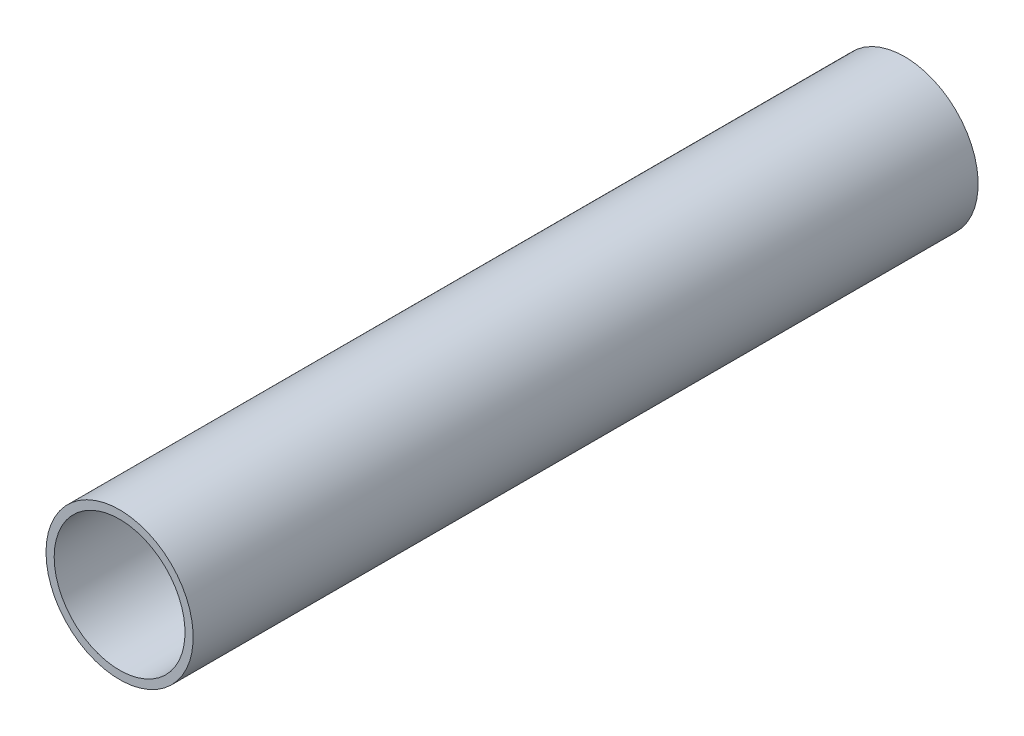
ISO-10303-21;
HEADER;
FILE_DESCRIPTION(('STEP AP214'),'2;1');
FILE_NAME('part.step','',(''),(''),'','','');
FILE_SCHEMA(('AUTOMOTIVE_DESIGN { 1 0 10303 214 1 1 1 1 }'));
ENDSEC;
DATA;
#1=APPLICATION_CONTEXT('core data for automotive mechanical design processes');
#2=APPLICATION_PROTOCOL_DEFINITION('international standard','automotive_design',2000,#1);
#3=PRODUCT_CONTEXT('',#1,'mechanical');
#4=PRODUCT('Part','Part','',(#3));
#5=PRODUCT_RELATED_PRODUCT_CATEGORY('part','',(#4));
#6=PRODUCT_DEFINITION_FORMATION('','',#4);
#7=PRODUCT_DEFINITION_CONTEXT('part definition',#1,'design');
#8=PRODUCT_DEFINITION('design','',#6,#7);
#9=PRODUCT_DEFINITION_SHAPE('','',#8);
#10=(LENGTH_UNIT() NAMED_UNIT(*) SI_UNIT(.MILLI.,.METRE.));
#11=(NAMED_UNIT(*) PLANE_ANGLE_UNIT() SI_UNIT($,.RADIAN.));
#12=(NAMED_UNIT(*) SI_UNIT($,.STERADIAN.) SOLID_ANGLE_UNIT());
#13=UNCERTAINTY_MEASURE_WITH_UNIT(LENGTH_MEASURE(1.E-05),#10,'distance_accuracy_value','');
#14=(GEOMETRIC_REPRESENTATION_CONTEXT(3) GLOBAL_UNCERTAINTY_ASSIGNED_CONTEXT((#13)) GLOBAL_UNIT_ASSIGNED_CONTEXT((#10,
#11,#12)) REPRESENTATION_CONTEXT('',''));
#15=CARTESIAN_POINT('',(0.,0.,0.));
#16=DIRECTION('',(0.,0.,1.));
#17=DIRECTION('',(1.,0.,0.));
#18=AXIS2_PLACEMENT_3D('',#15,#16,#17);
#19=CARTESIAN_POINT('',(0.,0.,304.8));
#20=DIRECTION('',(0.,0.,1.));
#21=DIRECTION('',(1.,0.,0.));
#22=AXIS2_PLACEMENT_3D('',#19,#20,#21);
#23=PLANE('',#22);
#24=CARTESIAN_POINT('',(0.,0.,304.8));
#25=DIRECTION('',(0.,0.,1.));
#26=DIRECTION('',(1.,0.,0.));
#27=AXIS2_PLACEMENT_3D('',#24,#25,#26);
#28=CIRCLE('',#27,57.15);
#29=CARTESIAN_POINT('',(-57.15,0.,304.8));
#30=VERTEX_POINT('',#29);
#31=EDGE_CURVE('E10',#30,#30,#28,.T.);
#32=ORIENTED_EDGE('',*,*,#31,.T.);
#33=EDGE_LOOP('',(#32));
#34=FACE_BOUND('',#33,.T.);
#35=CARTESIAN_POINT('',(0.,0.,304.8));
#36=DIRECTION('',(0.,0.,1.));
#37=DIRECTION('',(1.,0.,0.));
#38=AXIS2_PLACEMENT_3D('',#35,#36,#37);
#39=CIRCLE('',#38,50.8);
#40=CARTESIAN_POINT('',(-50.8,0.,304.8));
#41=VERTEX_POINT('',#40);
#42=EDGE_CURVE('E41',#41,#41,#39,.T.);
#43=ORIENTED_EDGE('',*,*,#42,.F.);
#44=EDGE_LOOP('',(#43));
#45=FACE_BOUND('',#44,.T.);
#46=ADVANCED_FACE('F30',(#34,#45),#23,.T.);
#47=CARTESIAN_POINT('',(0.,0.,-304.8));
#48=DIRECTION('',(0.,0.,1.));
#49=DIRECTION('',(1.,0.,0.));
#50=AXIS2_PLACEMENT_3D('',#47,#48,#49);
#51=PLANE('',#50);
#52=CARTESIAN_POINT('',(0.,0.,-304.8));
#53=DIRECTION('',(0.,0.,1.));
#54=DIRECTION('',(1.,0.,0.));
#55=AXIS2_PLACEMENT_3D('',#52,#53,#54);
#56=CIRCLE('',#55,57.15);
#57=CARTESIAN_POINT('',(-57.15,0.,-304.8));
#58=VERTEX_POINT('',#57);
#59=EDGE_CURVE('E34',#58,#58,#56,.T.);
#60=ORIENTED_EDGE('',*,*,#59,.F.);
#61=EDGE_LOOP('',(#60));
#62=FACE_BOUND('',#61,.T.);
#63=CARTESIAN_POINT('',(0.,0.,-304.8));
#64=DIRECTION('',(0.,0.,1.));
#65=DIRECTION('',(1.,0.,0.));
#66=AXIS2_PLACEMENT_3D('',#63,#64,#65);
#67=CIRCLE('',#66,50.8);
#68=CARTESIAN_POINT('',(-50.8,0.,-304.8));
#69=VERTEX_POINT('',#68);
#70=EDGE_CURVE('E43',#69,#69,#67,.T.);
#71=ORIENTED_EDGE('',*,*,#70,.T.);
#72=EDGE_LOOP('',(#71));
#73=FACE_BOUND('',#72,.T.);
#74=ADVANCED_FACE('F53',(#62,#73),#51,.F.);
#75=CARTESIAN_POINT('',(0.,0.,304.8));
#76=DIRECTION('',(0.,0.,-1.));
#77=DIRECTION('',(-1.,0.,0.));
#78=AXIS2_PLACEMENT_3D('',#75,#76,#77);
#79=CYLINDRICAL_SURFACE('',#78,57.15);
#80=CARTESIAN_POINT('',(-57.15,0.,304.8));
#81=CARTESIAN_POINT('',(-57.15,0.,298.45));
#82=CARTESIAN_POINT('',(-57.15,0.,292.1));
#83=CARTESIAN_POINT('',(-57.15,0.,279.4));
#84=CARTESIAN_POINT('',(-57.15,0.,273.05));
#85=CARTESIAN_POINT('',(-57.15,0.,260.35));
#86=CARTESIAN_POINT('',(-57.15,0.,254.));
#87=CARTESIAN_POINT('',(-57.15,0.,241.3));
#88=CARTESIAN_POINT('',(-57.15,0.,234.95));
#89=CARTESIAN_POINT('',(-57.15,0.,222.25));
#90=CARTESIAN_POINT('',(-57.15,0.,215.9));
#91=CARTESIAN_POINT('',(-57.15,0.,203.2));
#92=CARTESIAN_POINT('',(-57.15,0.,196.85));
#93=CARTESIAN_POINT('',(-57.15,0.,184.15));
#94=CARTESIAN_POINT('',(-57.15,0.,177.8));
#95=CARTESIAN_POINT('',(-57.15,0.,165.1));
#96=CARTESIAN_POINT('',(-57.15,0.,158.75));
#97=CARTESIAN_POINT('',(-57.15,0.,146.05));
#98=CARTESIAN_POINT('',(-57.15,0.,139.7));
#99=CARTESIAN_POINT('',(-57.15,0.,127.));
#100=CARTESIAN_POINT('',(-57.15,0.,120.65));
#101=CARTESIAN_POINT('',(-57.15,0.,107.95));
#102=CARTESIAN_POINT('',(-57.15,0.,101.6));
#103=CARTESIAN_POINT('',(-57.15,0.,88.9));
#104=CARTESIAN_POINT('',(-57.15,0.,82.55));
#105=CARTESIAN_POINT('',(-57.15,0.,69.85));
#106=CARTESIAN_POINT('',(-57.15,0.,63.5));
#107=CARTESIAN_POINT('',(-57.15,0.,50.8));
#108=CARTESIAN_POINT('',(-57.15,0.,44.45));
#109=CARTESIAN_POINT('',(-57.15,0.,31.75));
#110=CARTESIAN_POINT('',(-57.15,0.,25.4));
#111=CARTESIAN_POINT('',(-57.15,0.,12.7));
#112=CARTESIAN_POINT('',(-57.15,0.,6.34999999999995));
#113=CARTESIAN_POINT('',(-57.15,0.,-6.35000000000006));
#114=CARTESIAN_POINT('',(-57.15,0.,-12.7000000000001));
#115=CARTESIAN_POINT('',(-57.15,0.,-25.4000000000001));
#116=CARTESIAN_POINT('',(-57.15,0.,-31.7500000000001));
#117=CARTESIAN_POINT('',(-57.15,0.,-44.4500000000001));
#118=CARTESIAN_POINT('',(-57.15,0.,-50.8000000000001));
#119=CARTESIAN_POINT('',(-57.15,0.,-63.5000000000001));
#120=CARTESIAN_POINT('',(-57.15,0.,-69.8500000000001));
#121=CARTESIAN_POINT('',(-57.15,0.,-82.5500000000001));
#122=CARTESIAN_POINT('',(-57.15,0.,-88.9000000000001));
#123=CARTESIAN_POINT('',(-57.15,0.,-101.6));
#124=CARTESIAN_POINT('',(-57.15,0.,-107.95));
#125=CARTESIAN_POINT('',(-57.15,0.,-120.65));
#126=CARTESIAN_POINT('',(-57.15,0.,-127.));
#127=CARTESIAN_POINT('',(-57.15,0.,-139.7));
#128=CARTESIAN_POINT('',(-57.15,0.,-146.05));
#129=CARTESIAN_POINT('',(-57.15,0.,-158.75));
#130=CARTESIAN_POINT('',(-57.15,0.,-165.1));
#131=CARTESIAN_POINT('',(-57.15,0.,-177.8));
#132=CARTESIAN_POINT('',(-57.15,0.,-184.15));
#133=CARTESIAN_POINT('',(-57.15,0.,-196.85));
#134=CARTESIAN_POINT('',(-57.15,0.,-203.2));
#135=CARTESIAN_POINT('',(-57.15,0.,-215.9));
#136=CARTESIAN_POINT('',(-57.15,0.,-222.25));
#137=CARTESIAN_POINT('',(-57.15,0.,-234.95));
#138=CARTESIAN_POINT('',(-57.15,0.,-241.3));
#139=CARTESIAN_POINT('',(-57.15,0.,-254.));
#140=CARTESIAN_POINT('',(-57.15,0.,-260.35));
#141=CARTESIAN_POINT('',(-57.15,0.,-273.05));
#142=CARTESIAN_POINT('',(-57.15,0.,-279.4));
#143=CARTESIAN_POINT('',(-57.15,0.,-292.1));
#144=CARTESIAN_POINT('',(-57.15,0.,-298.45));
#145=CARTESIAN_POINT('',(-57.15,0.,-304.8));
#146=B_SPLINE_CURVE_WITH_KNOTS('',3,(#80,#81,#82,#83,#84,#85,#86,#87,#88,#89,#90,#91,#92,#93,
#94,#95,#96,#97,#98,#99,#100,#101,#102,#103,#104,#105,#106,#107,#108,#109,#110,#111,#112,#113,
#114,#115,#116,#117,#118,#119,#120,#121,#122,#123,#124,#125,#126,#127,#128,#129,#130,#131,#132,
#133,#134,#135,#136,#137,#138,#139,#140,#141,#142,#143,#144,#145),.UNSPECIFIED.,.F.,.F.,(4,2,2,
2,2,2,2,2,2,2,2,2,2,2,2,2,2,2,2,2,2,2,2,2,2,2,2,2,2,2,2,2,4),(0.,19.05,38.1,57.15,76.2,95.25,
114.3,133.35,152.4,171.45,190.5,209.55,228.6,247.65,266.7,285.75,304.8,323.85,342.9,361.95,381.,
400.05,419.1,438.15,457.2,476.25,495.3,514.35,533.4,552.45,571.5,590.55,609.6),.UNSPECIFIED.);
#147=EDGE_CURVE('BSEAM32',#30,#58,#146,.T.);
#148=ORIENTED_EDGE('',*,*,#31,.F.);
#149=ORIENTED_EDGE('',*,*,#59,.T.);
#150=ORIENTED_EDGE('',*,*,#147,.T.);
#151=ORIENTED_EDGE('',*,*,#147,.F.);
#152=EDGE_LOOP('',(#148,#150,#149,#151));
#153=FACE_BOUND('',#152,.T.);
#154=ADVANCED_FACE('F32',(#153),#79,.T.);
#155=CARTESIAN_POINT('',(0.,0.,304.8));
#156=DIRECTION('',(0.,0.,-1.));
#157=DIRECTION('',(-1.,0.,0.));
#158=AXIS2_PLACEMENT_3D('',#155,#156,#157);
#159=CYLINDRICAL_SURFACE('',#158,50.8);
#160=CARTESIAN_POINT('',(-50.8,0.,304.8));
#161=CARTESIAN_POINT('',(-50.8,0.,298.45));
#162=CARTESIAN_POINT('',(-50.8,0.,292.1));
#163=CARTESIAN_POINT('',(-50.8,0.,279.4));
#164=CARTESIAN_POINT('',(-50.8,0.,273.05));
#165=CARTESIAN_POINT('',(-50.8,0.,260.35));
#166=CARTESIAN_POINT('',(-50.8,0.,254.));
#167=CARTESIAN_POINT('',(-50.8,0.,241.3));
#168=CARTESIAN_POINT('',(-50.8,0.,234.95));
#169=CARTESIAN_POINT('',(-50.8,0.,222.25));
#170=CARTESIAN_POINT('',(-50.8,0.,215.9));
#171=CARTESIAN_POINT('',(-50.8,0.,203.2));
#172=CARTESIAN_POINT('',(-50.8,0.,196.85));
#173=CARTESIAN_POINT('',(-50.8,0.,184.15));
#174=CARTESIAN_POINT('',(-50.8,0.,177.8));
#175=CARTESIAN_POINT('',(-50.8,0.,165.1));
#176=CARTESIAN_POINT('',(-50.8,0.,158.75));
#177=CARTESIAN_POINT('',(-50.8,0.,146.05));
#178=CARTESIAN_POINT('',(-50.8,0.,139.7));
#179=CARTESIAN_POINT('',(-50.8,0.,127.));
#180=CARTESIAN_POINT('',(-50.8,0.,120.65));
#181=CARTESIAN_POINT('',(-50.8,0.,107.95));
#182=CARTESIAN_POINT('',(-50.8,0.,101.6));
#183=CARTESIAN_POINT('',(-50.8,0.,88.9));
#184=CARTESIAN_POINT('',(-50.8,0.,82.55));
#185=CARTESIAN_POINT('',(-50.8,0.,69.85));
#186=CARTESIAN_POINT('',(-50.8,0.,63.5));
#187=CARTESIAN_POINT('',(-50.8,0.,50.8));
#188=CARTESIAN_POINT('',(-50.8,0.,44.45));
#189=CARTESIAN_POINT('',(-50.8,0.,31.75));
#190=CARTESIAN_POINT('',(-50.8,0.,25.4));
#191=CARTESIAN_POINT('',(-50.8,0.,12.7));
#192=CARTESIAN_POINT('',(-50.8,0.,6.35));
#193=CARTESIAN_POINT('',(-50.8,0.,-6.35));
#194=CARTESIAN_POINT('',(-50.8,0.,-12.7));
#195=CARTESIAN_POINT('',(-50.8,0.,-25.4));
#196=CARTESIAN_POINT('',(-50.8,0.,-31.75));
#197=CARTESIAN_POINT('',(-50.8,0.,-44.45));
#198=CARTESIAN_POINT('',(-50.8,0.,-50.8));
#199=CARTESIAN_POINT('',(-50.8,0.,-63.5));
#200=CARTESIAN_POINT('',(-50.8,0.,-69.85));
#201=CARTESIAN_POINT('',(-50.8,0.,-82.55));
#202=CARTESIAN_POINT('',(-50.8,0.,-88.9));
#203=CARTESIAN_POINT('',(-50.8,0.,-101.6));
#204=CARTESIAN_POINT('',(-50.8,0.,-107.95));
#205=CARTESIAN_POINT('',(-50.8,0.,-120.65));
#206=CARTESIAN_POINT('',(-50.8,0.,-127.));
#207=CARTESIAN_POINT('',(-50.8,0.,-139.7));
#208=CARTESIAN_POINT('',(-50.8,0.,-146.05));
#209=CARTESIAN_POINT('',(-50.8,0.,-158.75));
#210=CARTESIAN_POINT('',(-50.8,0.,-165.1));
#211=CARTESIAN_POINT('',(-50.8,0.,-177.8));
#212=CARTESIAN_POINT('',(-50.8,0.,-184.15));
#213=CARTESIAN_POINT('',(-50.8,0.,-196.85));
#214=CARTESIAN_POINT('',(-50.8,0.,-203.2));
#215=CARTESIAN_POINT('',(-50.8,0.,-215.9));
#216=CARTESIAN_POINT('',(-50.8,0.,-222.25));
#217=CARTESIAN_POINT('',(-50.8,0.,-234.95));
#218=CARTESIAN_POINT('',(-50.8,0.,-241.3));
#219=CARTESIAN_POINT('',(-50.8,0.,-254.));
#220=CARTESIAN_POINT('',(-50.8,0.,-260.35));
#221=CARTESIAN_POINT('',(-50.8,0.,-273.05));
#222=CARTESIAN_POINT('',(-50.8,0.,-279.4));
#223=CARTESIAN_POINT('',(-50.8,0.,-292.1));
#224=CARTESIAN_POINT('',(-50.8,0.,-298.45));
#225=CARTESIAN_POINT('',(-50.8,0.,-304.8));
#226=B_SPLINE_CURVE_WITH_KNOTS('',3,(#160,#161,#162,#163,#164,#165,#166,#167,#168,#169,#170,
#171,#172,#173,#174,#175,#176,#177,#178,#179,#180,#181,#182,#183,#184,#185,#186,#187,#188,#189,
#190,#191,#192,#193,#194,#195,#196,#197,#198,#199,#200,#201,#202,#203,#204,#205,#206,#207,#208,
#209,#210,#211,#212,#213,#214,#215,#216,#217,#218,#219,#220,#221,#222,#223,#224,#225),
.UNSPECIFIED.,.F.,.F.,(4,2,2,2,2,2,2,2,2,2,2,2,2,2,2,2,2,2,2,2,2,2,2,2,2,2,2,2,2,2,2,2,4),(0.,
19.05,38.1,57.15,76.2,95.2500000000001,114.3,133.35,152.4,171.45,190.5,209.55,228.6,247.65,
266.7,285.75,304.8,323.85,342.9,361.95,381.,400.05,419.1,438.15,457.2,476.25,495.3,514.35,533.4,
552.45,571.5,590.55,609.6),.UNSPECIFIED.);
#227=EDGE_CURVE('BSEAM49',#41,#69,#226,.T.);
#228=ORIENTED_EDGE('',*,*,#42,.T.);
#229=ORIENTED_EDGE('',*,*,#70,.F.);
#230=ORIENTED_EDGE('',*,*,#227,.T.);
#231=ORIENTED_EDGE('',*,*,#227,.F.);
#232=EDGE_LOOP('',(#228,#230,#229,#231));
#233=FACE_BOUND('',#232,.T.);
#234=ADVANCED_FACE('F49',(#233),#159,.F.);
#235=CLOSED_SHELL('',(#46,#74,#154,#234));
#236=MANIFOLD_SOLID_BREP('B2',#235);
#237=ADVANCED_BREP_SHAPE_REPRESENTATION('',(#18,#236),#14);
#238=SHAPE_DEFINITION_REPRESENTATION(#9,#237);
ENDSEC;
END-ISO-10303-21;
